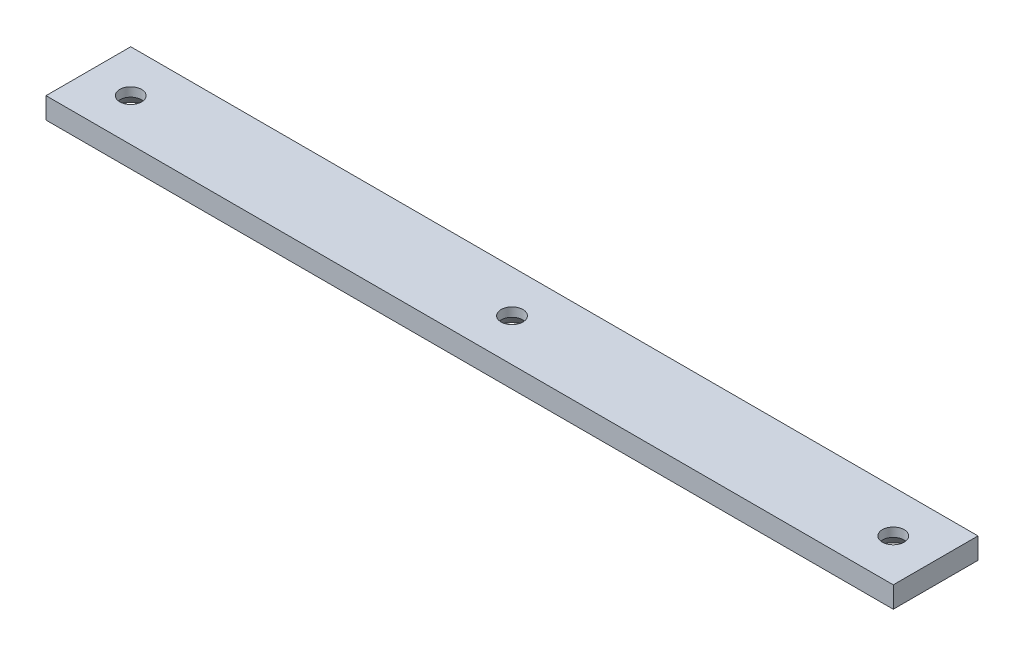
ISO-10303-21;
HEADER;
FILE_DESCRIPTION(('STEP AP214'),'2;1');
FILE_NAME('part.step','',(''),(''),'','','');
FILE_SCHEMA(('AUTOMOTIVE_DESIGN { 1 0 10303 214 1 1 1 1 }'));
ENDSEC;
DATA;
#1=APPLICATION_CONTEXT('core data for automotive mechanical design processes');
#2=APPLICATION_PROTOCOL_DEFINITION('international standard','automotive_design',2000,#1);
#3=PRODUCT_CONTEXT('',#1,'mechanical');
#4=PRODUCT('Part','Part','',(#3));
#5=PRODUCT_RELATED_PRODUCT_CATEGORY('part','',(#4));
#6=PRODUCT_DEFINITION_FORMATION('','',#4);
#7=PRODUCT_DEFINITION_CONTEXT('part definition',#1,'design');
#8=PRODUCT_DEFINITION('design','',#6,#7);
#9=PRODUCT_DEFINITION_SHAPE('','',#8);
#10=(LENGTH_UNIT() NAMED_UNIT(*) SI_UNIT(.MILLI.,.METRE.));
#11=(NAMED_UNIT(*) PLANE_ANGLE_UNIT() SI_UNIT($,.RADIAN.));
#12=(NAMED_UNIT(*) SI_UNIT($,.STERADIAN.) SOLID_ANGLE_UNIT());
#13=UNCERTAINTY_MEASURE_WITH_UNIT(LENGTH_MEASURE(1.E-05),#10,'distance_accuracy_value','');
#14=(GEOMETRIC_REPRESENTATION_CONTEXT(3) GLOBAL_UNCERTAINTY_ASSIGNED_CONTEXT((#13)) GLOBAL_UNIT_ASSIGNED_CONTEXT((#10,
#11,#12)) REPRESENTATION_CONTEXT('',''));
#15=CARTESIAN_POINT('',(0.,0.,0.));
#16=DIRECTION('',(0.,0.,1.));
#17=DIRECTION('',(1.,0.,0.));
#18=AXIS2_PLACEMENT_3D('',#15,#16,#17);
#19=CARTESIAN_POINT('',(0.,6.35,0.));
#20=DIRECTION('',(-1.,0.,0.));
#21=DIRECTION('',(0.,0.,1.));
#22=AXIS2_PLACEMENT_3D('',#19,#20,#21);
#23=PLANE('',#22);
#24=DIRECTION('',(0.,0.,-1.));
#25=VECTOR('',#24,1.);
#26=CARTESIAN_POINT('',(0.,0.,0.));
#27=LINE('',#26,#25);
#28=CARTESIAN_POINT('',(0.,0.,0.));
#29=VERTEX_POINT('',#28);
#30=CARTESIAN_POINT('',(0.,0.,-25.4));
#31=VERTEX_POINT('',#30);
#32=EDGE_CURVE('E99',#29,#31,#27,.T.);
#33=ORIENTED_EDGE('',*,*,#32,.T.);
#34=DIRECTION('',(0.,-1.,0.));
#35=VECTOR('',#34,1.);
#36=CARTESIAN_POINT('',(0.,6.35,-25.4));
#37=LINE('',#36,#35);
#38=CARTESIAN_POINT('',(0.,6.35,-25.4));
#39=VERTEX_POINT('',#38);
#40=EDGE_CURVE('E11',#39,#31,#37,.T.);
#41=ORIENTED_EDGE('',*,*,#40,.F.);
#42=DIRECTION('',(0.,0.,-1.));
#43=VECTOR('',#42,1.);
#44=CARTESIAN_POINT('',(0.,6.35,0.));
#45=LINE('',#44,#43);
#46=CARTESIAN_POINT('',(0.,6.35,0.));
#47=VERTEX_POINT('',#46);
#48=EDGE_CURVE('E87',#47,#39,#45,.T.);
#49=ORIENTED_EDGE('',*,*,#48,.F.);
#50=DIRECTION('',(0.,-1.,0.));
#51=VECTOR('',#50,1.);
#52=CARTESIAN_POINT('',(0.,6.35,0.));
#53=LINE('',#52,#51);
#54=EDGE_CURVE('E95',#47,#29,#53,.T.);
#55=ORIENTED_EDGE('',*,*,#54,.T.);
#56=EDGE_LOOP('',(#33,#41,#49,#55));
#57=FACE_BOUND('',#56,.T.);
#58=ADVANCED_FACE('F35',(#57),#23,.F.);
#59=CARTESIAN_POINT('',(0.,6.35,-25.4));
#60=DIRECTION('',(0.,0.,1.));
#61=DIRECTION('',(1.,0.,0.));
#62=AXIS2_PLACEMENT_3D('',#59,#60,#61);
#63=PLANE('',#62);
#64=DIRECTION('',(-1.,0.,0.));
#65=VECTOR('',#64,1.);
#66=CARTESIAN_POINT('',(0.,0.,-25.4));
#67=LINE('',#66,#65);
#68=CARTESIAN_POINT('',(-254.,0.,-25.4));
#69=VERTEX_POINT('',#68);
#70=EDGE_CURVE('E91',#31,#69,#67,.T.);
#71=ORIENTED_EDGE('',*,*,#70,.T.);
#72=DIRECTION('',(0.,-1.,0.));
#73=VECTOR('',#72,1.);
#74=CARTESIAN_POINT('',(-254.,6.35,-25.4));
#75=LINE('',#74,#73);
#76=CARTESIAN_POINT('',(-254.,6.35,-25.4));
#77=VERTEX_POINT('',#76);
#78=EDGE_CURVE('E44',#77,#69,#75,.T.);
#79=ORIENTED_EDGE('',*,*,#78,.F.);
#80=DIRECTION('',(-1.,0.,0.));
#81=VECTOR('',#80,1.);
#82=CARTESIAN_POINT('',(0.,6.35,-25.4));
#83=LINE('',#82,#81);
#84=EDGE_CURVE('E82',#39,#77,#83,.T.);
#85=ORIENTED_EDGE('',*,*,#84,.F.);
#86=ORIENTED_EDGE('',*,*,#40,.T.);
#87=EDGE_LOOP('',(#71,#79,#85,#86));
#88=FACE_BOUND('',#87,.T.);
#89=ADVANCED_FACE('F90',(#88),#63,.F.);
#90=CARTESIAN_POINT('',(-254.,6.35,0.));
#91=DIRECTION('',(1.,0.,0.));
#92=DIRECTION('',(0.,0.,-1.));
#93=AXIS2_PLACEMENT_3D('',#90,#91,#92);
#94=PLANE('',#93);
#95=DIRECTION('',(0.,0.,1.));
#96=VECTOR('',#95,1.);
#97=CARTESIAN_POINT('',(-254.,0.,0.));
#98=LINE('',#97,#96);
#99=CARTESIAN_POINT('',(-254.,0.,0.));
#100=VERTEX_POINT('',#99);
#101=EDGE_CURVE('E69',#69,#100,#98,.T.);
#102=ORIENTED_EDGE('',*,*,#101,.T.);
#103=DIRECTION('',(0.,-1.,0.));
#104=VECTOR('',#103,1.);
#105=CARTESIAN_POINT('',(-254.,6.35,0.));
#106=LINE('',#105,#104);
#107=CARTESIAN_POINT('',(-254.,6.35,0.));
#108=VERTEX_POINT('',#107);
#109=EDGE_CURVE('E92',#108,#100,#106,.T.);
#110=ORIENTED_EDGE('',*,*,#109,.F.);
#111=DIRECTION('',(0.,0.,1.));
#112=VECTOR('',#111,1.);
#113=CARTESIAN_POINT('',(-254.,6.35,0.));
#114=LINE('',#113,#112);
#115=EDGE_CURVE('E85',#77,#108,#114,.T.);
#116=ORIENTED_EDGE('',*,*,#115,.F.);
#117=ORIENTED_EDGE('',*,*,#78,.T.);
#118=EDGE_LOOP('',(#102,#110,#116,#117));
#119=FACE_BOUND('',#118,.T.);
#120=ADVANCED_FACE('F93',(#119),#94,.F.);
#121=CARTESIAN_POINT('',(0.,6.35,0.));
#122=DIRECTION('',(0.,0.,-1.));
#123=DIRECTION('',(-1.,0.,0.));
#124=AXIS2_PLACEMENT_3D('',#121,#122,#123);
#125=PLANE('',#124);
#126=DIRECTION('',(1.,0.,0.));
#127=VECTOR('',#126,1.);
#128=CARTESIAN_POINT('',(0.,0.,0.));
#129=LINE('',#128,#127);
#130=EDGE_CURVE('E75',#100,#29,#129,.T.);
#131=ORIENTED_EDGE('',*,*,#130,.T.);
#132=ORIENTED_EDGE('',*,*,#54,.F.);
#133=DIRECTION('',(1.,0.,0.));
#134=VECTOR('',#133,1.);
#135=CARTESIAN_POINT('',(0.,6.35,0.));
#136=LINE('',#135,#134);
#137=EDGE_CURVE('E52',#108,#47,#136,.T.);
#138=ORIENTED_EDGE('',*,*,#137,.F.);
#139=ORIENTED_EDGE('',*,*,#109,.T.);
#140=EDGE_LOOP('',(#131,#132,#138,#139));
#141=FACE_BOUND('',#140,.T.);
#142=ADVANCED_FACE('F115',(#141),#125,.F.);
#143=CARTESIAN_POINT('',(0.,6.35,0.));
#144=DIRECTION('',(0.,1.,0.));
#145=DIRECTION('',(0.,0.,1.));
#146=AXIS2_PLACEMENT_3D('',#143,#144,#145);
#147=PLANE('',#146);
#148=CARTESIAN_POINT('',(-241.3,6.35,-12.7));
#149=DIRECTION('',(0.,-1.,0.));
#150=DIRECTION('',(0.,0.,-1.));
#151=AXIS2_PLACEMENT_3D('',#148,#149,#150);
#152=CIRCLE('',#151,3.26389999999999);
#153=CARTESIAN_POINT('',(-241.3,6.35,-15.9639));
#154=VERTEX_POINT('',#153);
#155=EDGE_CURVE('E140',#154,#154,#152,.T.);
#156=ORIENTED_EDGE('',*,*,#155,.T.);
#157=EDGE_LOOP('',(#156));
#158=FACE_BOUND('',#157,.T.);
#159=CARTESIAN_POINT('',(-12.7,6.35,-12.7));
#160=DIRECTION('',(0.,-1.,0.));
#161=DIRECTION('',(0.,0.,-1.));
#162=AXIS2_PLACEMENT_3D('',#159,#160,#161);
#163=CIRCLE('',#162,3.2639);
#164=CARTESIAN_POINT('',(-12.7,6.35,-15.9639));
#165=VERTEX_POINT('',#164);
#166=EDGE_CURVE('E129',#165,#165,#163,.T.);
#167=ORIENTED_EDGE('',*,*,#166,.T.);
#168=EDGE_LOOP('',(#167));
#169=FACE_BOUND('',#168,.T.);
#170=CARTESIAN_POINT('',(-127.,6.35,-12.7));
#171=DIRECTION('',(0.,-1.,0.));
#172=DIRECTION('',(0.,0.,-1.));
#173=AXIS2_PLACEMENT_3D('',#170,#171,#172);
#174=CIRCLE('',#173,3.2639);
#175=CARTESIAN_POINT('',(-127.,6.35,-15.9639));
#176=VERTEX_POINT('',#175);
#177=EDGE_CURVE('E103',#176,#176,#174,.T.);
#178=ORIENTED_EDGE('',*,*,#177,.T.);
#179=EDGE_LOOP('',(#178));
#180=FACE_BOUND('',#179,.T.);
#181=ORIENTED_EDGE('',*,*,#48,.T.);
#182=ORIENTED_EDGE('',*,*,#84,.T.);
#183=ORIENTED_EDGE('',*,*,#115,.T.);
#184=ORIENTED_EDGE('',*,*,#137,.T.);
#185=EDGE_LOOP('',(#181,#182,#183,#184));
#186=FACE_BOUND('',#185,.T.);
#187=ADVANCED_FACE('F83',(#158,#169,#180,#186),#147,.T.);
#188=CARTESIAN_POINT('',(0.,0.,0.));
#189=DIRECTION('',(0.,1.,0.));
#190=DIRECTION('',(0.,0.,1.));
#191=AXIS2_PLACEMENT_3D('',#188,#189,#190);
#192=PLANE('',#191);
#193=CARTESIAN_POINT('',(-241.3,0.,-12.7));
#194=DIRECTION('',(0.,-1.,0.));
#195=DIRECTION('',(0.,0.,-1.));
#196=AXIS2_PLACEMENT_3D('',#193,#194,#195);
#197=CIRCLE('',#196,6.4389);
#198=CARTESIAN_POINT('',(-241.3,0.,-19.1389));
#199=VERTEX_POINT('',#198);
#200=EDGE_CURVE('E147',#199,#199,#197,.T.);
#201=ORIENTED_EDGE('',*,*,#200,.F.);
#202=EDGE_LOOP('',(#201));
#203=FACE_BOUND('',#202,.T.);
#204=CARTESIAN_POINT('',(-12.7,0.,-12.7));
#205=DIRECTION('',(0.,-1.,0.));
#206=DIRECTION('',(0.,0.,-1.));
#207=AXIS2_PLACEMENT_3D('',#204,#205,#206);
#208=CIRCLE('',#207,6.4389);
#209=CARTESIAN_POINT('',(-12.7,0.,-19.1389));
#210=VERTEX_POINT('',#209);
#211=EDGE_CURVE('E137',#210,#210,#208,.T.);
#212=ORIENTED_EDGE('',*,*,#211,.F.);
#213=EDGE_LOOP('',(#212));
#214=FACE_BOUND('',#213,.T.);
#215=CARTESIAN_POINT('',(-127.,0.,-12.7));
#216=DIRECTION('',(0.,-1.,0.));
#217=DIRECTION('',(0.,0.,-1.));
#218=AXIS2_PLACEMENT_3D('',#215,#216,#217);
#219=CIRCLE('',#218,6.4389);
#220=CARTESIAN_POINT('',(-127.,0.,-19.1389));
#221=VERTEX_POINT('',#220);
#222=EDGE_CURVE('E126',#221,#221,#219,.T.);
#223=ORIENTED_EDGE('',*,*,#222,.F.);
#224=EDGE_LOOP('',(#223));
#225=FACE_BOUND('',#224,.T.);
#226=ORIENTED_EDGE('',*,*,#32,.F.);
#227=ORIENTED_EDGE('',*,*,#130,.F.);
#228=ORIENTED_EDGE('',*,*,#101,.F.);
#229=ORIENTED_EDGE('',*,*,#70,.F.);
#230=EDGE_LOOP('',(#226,#227,#228,#229));
#231=FACE_BOUND('',#230,.T.);
#232=ADVANCED_FACE('F118',(#203,#214,#225,#231),#192,.F.);
#233=CARTESIAN_POINT('',(-127.,0.,-12.7));
#234=DIRECTION('',(0.,-1.,0.));
#235=DIRECTION('',(0.,0.,-1.));
#236=AXIS2_PLACEMENT_3D('',#233,#234,#235);
#237=CYLINDRICAL_SURFACE('',#236,3.2639);
#238=ORIENTED_EDGE('',*,*,#177,.F.);
#239=EDGE_LOOP('',(#238));
#240=FACE_BOUND('',#239,.T.);
#241=CARTESIAN_POINT('',(-127.,3.6524196929267,-12.7));
#242=DIRECTION('',(0.,-1.,0.));
#243=DIRECTION('',(0.,0.,-1.));
#244=AXIS2_PLACEMENT_3D('',#241,#242,#243);
#245=CIRCLE('',#244,3.2639);
#246=CARTESIAN_POINT('',(-127.,3.6524196929267,-15.9639));
#247=VERTEX_POINT('',#246);
#248=EDGE_CURVE('E123',#247,#247,#245,.T.);
#249=ORIENTED_EDGE('',*,*,#248,.T.);
#250=EDGE_LOOP('',(#249));
#251=FACE_BOUND('',#250,.T.);
#252=ADVANCED_FACE('F155',(#240,#251),#237,.F.);
#253=CARTESIAN_POINT('',(-127.,0.,-12.7));
#254=DIRECTION('',(0.,-1.,0.));
#255=DIRECTION('',(0.,0.,-1.));
#256=AXIS2_PLACEMENT_3D('',#253,#254,#255);
#257=CONICAL_SURFACE('',#256,6.4389,0.715584993317675);
#258=ORIENTED_EDGE('',*,*,#248,.F.);
#259=EDGE_LOOP('',(#258));
#260=FACE_BOUND('',#259,.T.);
#261=ORIENTED_EDGE('',*,*,#222,.T.);
#262=EDGE_LOOP('',(#261));
#263=FACE_BOUND('',#262,.T.);
#264=ADVANCED_FACE('F161',(#260,#263),#257,.F.);
#265=CARTESIAN_POINT('',(-12.7,0.,-12.7));
#266=DIRECTION('',(0.,-1.,0.));
#267=DIRECTION('',(0.,0.,-1.));
#268=AXIS2_PLACEMENT_3D('',#265,#266,#267);
#269=CYLINDRICAL_SURFACE('',#268,3.2639);
#270=ORIENTED_EDGE('',*,*,#166,.F.);
#271=EDGE_LOOP('',(#270));
#272=FACE_BOUND('',#271,.T.);
#273=CARTESIAN_POINT('',(-12.7,3.6524196929267,-12.7));
#274=DIRECTION('',(0.,-1.,0.));
#275=DIRECTION('',(0.,0.,-1.));
#276=AXIS2_PLACEMENT_3D('',#273,#274,#275);
#277=CIRCLE('',#276,3.2639);
#278=CARTESIAN_POINT('',(-12.7,3.6524196929267,-15.9639));
#279=VERTEX_POINT('',#278);
#280=EDGE_CURVE('E133',#279,#279,#277,.T.);
#281=ORIENTED_EDGE('',*,*,#280,.T.);
#282=EDGE_LOOP('',(#281));
#283=FACE_BOUND('',#282,.T.);
#284=ADVANCED_FACE('F163',(#272,#283),#269,.F.);
#285=CARTESIAN_POINT('',(-12.7,0.,-12.7));
#286=DIRECTION('',(0.,-1.,0.));
#287=DIRECTION('',(0.,0.,-1.));
#288=AXIS2_PLACEMENT_3D('',#285,#286,#287);
#289=CONICAL_SURFACE('',#288,6.4389,0.715584993317676);
#290=ORIENTED_EDGE('',*,*,#280,.F.);
#291=EDGE_LOOP('',(#290));
#292=FACE_BOUND('',#291,.T.);
#293=ORIENTED_EDGE('',*,*,#211,.T.);
#294=EDGE_LOOP('',(#293));
#295=FACE_BOUND('',#294,.T.);
#296=ADVANCED_FACE('F170',(#292,#295),#289,.F.);
#297=CARTESIAN_POINT('',(-241.3,0.,-12.7));
#298=DIRECTION('',(0.,-1.,0.));
#299=DIRECTION('',(0.,0.,-1.));
#300=AXIS2_PLACEMENT_3D('',#297,#298,#299);
#301=CYLINDRICAL_SURFACE('',#300,3.26389999999999);
#302=ORIENTED_EDGE('',*,*,#155,.F.);
#303=EDGE_LOOP('',(#302));
#304=FACE_BOUND('',#303,.T.);
#305=CARTESIAN_POINT('',(-241.3,3.6524196929267,-12.7));
#306=DIRECTION('',(0.,-1.,0.));
#307=DIRECTION('',(0.,0.,-1.));
#308=AXIS2_PLACEMENT_3D('',#305,#306,#307);
#309=CIRCLE('',#308,3.26389999999999);
#310=CARTESIAN_POINT('',(-241.3,3.6524196929267,-15.9639));
#311=VERTEX_POINT('',#310);
#312=EDGE_CURVE('E143',#311,#311,#309,.T.);
#313=ORIENTED_EDGE('',*,*,#312,.T.);
#314=EDGE_LOOP('',(#313));
#315=FACE_BOUND('',#314,.T.);
#316=ADVANCED_FACE('F215',(#304,#315),#301,.F.);
#317=CARTESIAN_POINT('',(-241.3,0.,-12.7));
#318=DIRECTION('',(0.,-1.,0.));
#319=DIRECTION('',(0.,0.,-1.));
#320=AXIS2_PLACEMENT_3D('',#317,#318,#319);
#321=CONICAL_SURFACE('',#320,6.4389,0.715584993317677);
#322=ORIENTED_EDGE('',*,*,#312,.F.);
#323=EDGE_LOOP('',(#322));
#324=FACE_BOUND('',#323,.T.);
#325=ORIENTED_EDGE('',*,*,#200,.T.);
#326=EDGE_LOOP('',(#325));
#327=FACE_BOUND('',#326,.T.);
#328=ADVANCED_FACE('F151',(#324,#327),#321,.F.);
#329=CLOSED_SHELL('',(#58,#89,#120,#142,#187,#232,#252,#264,#284,#296,#316,#328));
#330=MANIFOLD_SOLID_BREP('B2',#329);
#331=ADVANCED_BREP_SHAPE_REPRESENTATION('',(#18,#330),#14);
#332=SHAPE_DEFINITION_REPRESENTATION(#9,#331);
ENDSEC;
END-ISO-10303-21;
